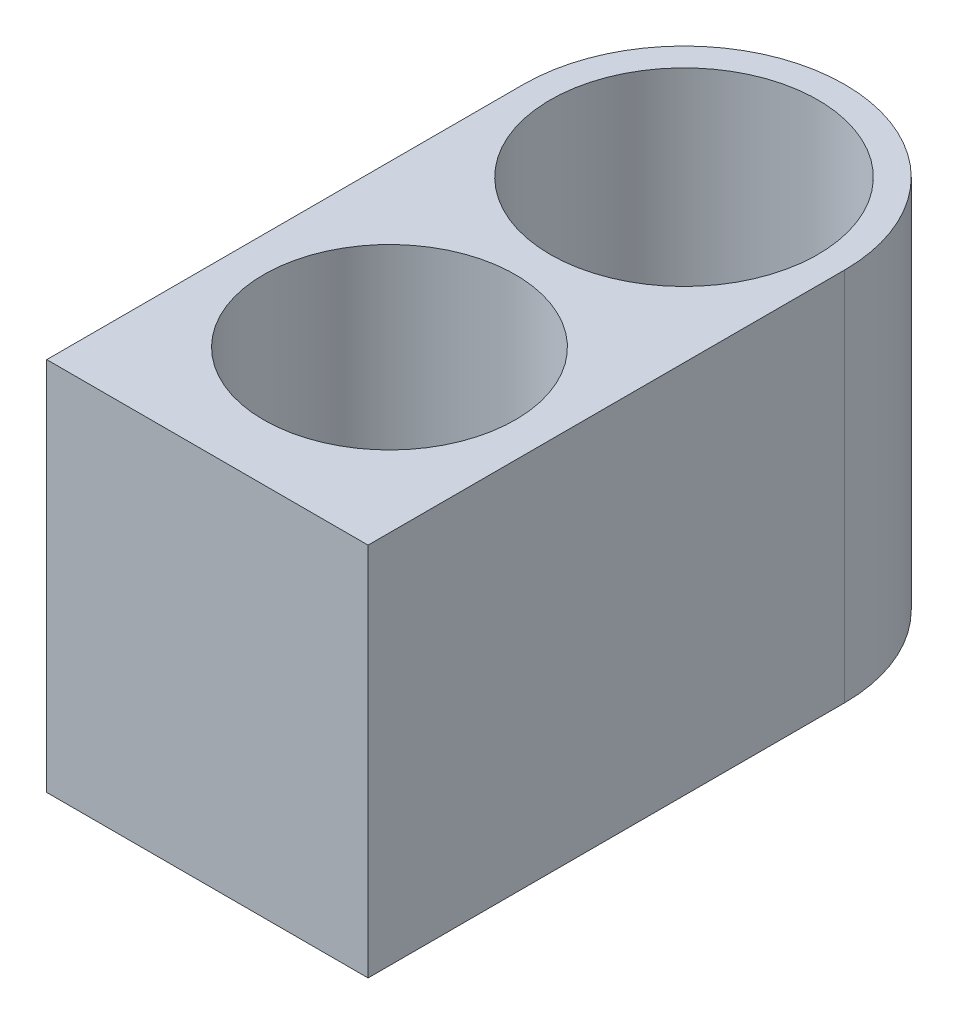
ISO-10303-21;
HEADER;
FILE_DESCRIPTION(('STEP AP214'),'2;1');
FILE_NAME('part.step','',(''),(''),'','','');
FILE_SCHEMA(('AUTOMOTIVE_DESIGN { 1 0 10303 214 1 1 1 1 }'));
ENDSEC;
DATA;
#1=APPLICATION_CONTEXT('core data for automotive mechanical design processes');
#2=APPLICATION_PROTOCOL_DEFINITION('international standard','automotive_design',2000,#1);
#3=PRODUCT_CONTEXT('',#1,'mechanical');
#4=PRODUCT('Part','Part','',(#3));
#5=PRODUCT_RELATED_PRODUCT_CATEGORY('part','',(#4));
#6=PRODUCT_DEFINITION_FORMATION('','',#4);
#7=PRODUCT_DEFINITION_CONTEXT('part definition',#1,'design');
#8=PRODUCT_DEFINITION('design','',#6,#7);
#9=PRODUCT_DEFINITION_SHAPE('','',#8);
#10=(LENGTH_UNIT() NAMED_UNIT(*) SI_UNIT(.MILLI.,.METRE.));
#11=(NAMED_UNIT(*) PLANE_ANGLE_UNIT() SI_UNIT($,.RADIAN.));
#12=(NAMED_UNIT(*) SI_UNIT($,.STERADIAN.) SOLID_ANGLE_UNIT());
#13=UNCERTAINTY_MEASURE_WITH_UNIT(LENGTH_MEASURE(1.E-05),#10,'distance_accuracy_value','');
#14=(GEOMETRIC_REPRESENTATION_CONTEXT(3) GLOBAL_UNCERTAINTY_ASSIGNED_CONTEXT((#13)) GLOBAL_UNIT_ASSIGNED_CONTEXT((#10,
#11,#12)) REPRESENTATION_CONTEXT('',''));
#15=CARTESIAN_POINT('',(0.,0.,0.));
#16=DIRECTION('',(0.,0.,1.));
#17=DIRECTION('',(1.,0.,0.));
#18=AXIS2_PLACEMENT_3D('',#15,#16,#17);
#19=CARTESIAN_POINT('',(3.,7.,6.));
#20=DIRECTION('',(-1.,0.,0.));
#21=DIRECTION('',(0.,0.,1.));
#22=AXIS2_PLACEMENT_3D('',#19,#20,#21);
#23=PLANE('',#22);
#24=DIRECTION('',(0.,1.,0.));
#25=VECTOR('',#24,1.);
#26=CARTESIAN_POINT('',(3.,0.,-2.9));
#27=LINE('',#26,#25);
#28=CARTESIAN_POINT('',(3.,0.,-2.9));
#29=VERTEX_POINT('',#28);
#30=CARTESIAN_POINT('',(3.,7.,-2.9));
#31=VERTEX_POINT('',#30);
#32=EDGE_CURVE('E53',#29,#31,#27,.T.);
#33=ORIENTED_EDGE('',*,*,#32,.T.);
#34=DIRECTION('',(0.,0.,-1.));
#35=VECTOR('',#34,1.);
#36=CARTESIAN_POINT('',(3.,7.,6.));
#37=LINE('',#36,#35);
#38=CARTESIAN_POINT('',(3.,7.,6.));
#39=VERTEX_POINT('',#38);
#40=EDGE_CURVE('E82',#39,#31,#37,.T.);
#41=ORIENTED_EDGE('',*,*,#40,.F.);
#42=DIRECTION('',(0.,-1.,0.));
#43=VECTOR('',#42,1.);
#44=CARTESIAN_POINT('',(3.,7.,6.));
#45=LINE('',#44,#43);
#46=CARTESIAN_POINT('',(3.,0.,6.));
#47=VERTEX_POINT('',#46);
#48=EDGE_CURVE('E46',#39,#47,#45,.T.);
#49=ORIENTED_EDGE('',*,*,#48,.T.);
#50=DIRECTION('',(0.,0.,-1.));
#51=VECTOR('',#50,1.);
#52=CARTESIAN_POINT('',(3.,0.,6.));
#53=LINE('',#52,#51);
#54=EDGE_CURVE('E87',#47,#29,#53,.T.);
#55=ORIENTED_EDGE('',*,*,#54,.T.);
#56=EDGE_LOOP('',(#33,#41,#49,#55));
#57=FACE_BOUND('',#56,.T.);
#58=ADVANCED_FACE('F39',(#57),#23,.F.);
#59=CARTESIAN_POINT('',(-3.,7.,6.));
#60=DIRECTION('',(1.,0.,0.));
#61=DIRECTION('',(0.,0.,-1.));
#62=AXIS2_PLACEMENT_3D('',#59,#60,#61);
#63=PLANE('',#62);
#64=DIRECTION('',(0.,0.,1.));
#65=VECTOR('',#64,1.);
#66=CARTESIAN_POINT('',(-3.,7.,6.));
#67=LINE('',#66,#65);
#68=CARTESIAN_POINT('',(-3.,7.,-2.9));
#69=VERTEX_POINT('',#68);
#70=CARTESIAN_POINT('',(-3.,7.,6.));
#71=VERTEX_POINT('',#70);
#72=EDGE_CURVE('E99',#69,#71,#67,.T.);
#73=ORIENTED_EDGE('',*,*,#72,.F.);
#74=DIRECTION('',(0.,1.,0.));
#75=VECTOR('',#74,1.);
#76=CARTESIAN_POINT('',(-3.,0.,-2.9));
#77=LINE('',#76,#75);
#78=CARTESIAN_POINT('',(-3.,0.,-2.9));
#79=VERTEX_POINT('',#78);
#80=EDGE_CURVE('E106',#79,#69,#77,.T.);
#81=ORIENTED_EDGE('',*,*,#80,.F.);
#82=DIRECTION('',(0.,0.,1.));
#83=VECTOR('',#82,1.);
#84=CARTESIAN_POINT('',(-3.,0.,6.));
#85=LINE('',#84,#83);
#86=CARTESIAN_POINT('',(-3.,0.,6.));
#87=VERTEX_POINT('',#86);
#88=EDGE_CURVE('E83',#79,#87,#85,.T.);
#89=ORIENTED_EDGE('',*,*,#88,.T.);
#90=DIRECTION('',(0.,-1.,0.));
#91=VECTOR('',#90,1.);
#92=CARTESIAN_POINT('',(-3.,7.,6.));
#93=LINE('',#92,#91);
#94=EDGE_CURVE('E11',#71,#87,#93,.T.);
#95=ORIENTED_EDGE('',*,*,#94,.F.);
#96=EDGE_LOOP('',(#73,#81,#89,#95));
#97=FACE_BOUND('',#96,.T.);
#98=ADVANCED_FACE('F134',(#97),#63,.F.);
#99=CARTESIAN_POINT('',(-3.,7.,6.));
#100=DIRECTION('',(0.,0.,-1.));
#101=DIRECTION('',(-1.,0.,0.));
#102=AXIS2_PLACEMENT_3D('',#99,#100,#101);
#103=PLANE('',#102);
#104=DIRECTION('',(1.,0.,0.));
#105=VECTOR('',#104,1.);
#106=CARTESIAN_POINT('',(-3.,0.,6.));
#107=LINE('',#106,#105);
#108=EDGE_CURVE('E74',#87,#47,#107,.T.);
#109=ORIENTED_EDGE('',*,*,#108,.T.);
#110=ORIENTED_EDGE('',*,*,#48,.F.);
#111=DIRECTION('',(1.,0.,0.));
#112=VECTOR('',#111,1.);
#113=CARTESIAN_POINT('',(-3.,7.,6.));
#114=LINE('',#113,#112);
#115=EDGE_CURVE('E62',#71,#39,#114,.T.);
#116=ORIENTED_EDGE('',*,*,#115,.F.);
#117=ORIENTED_EDGE('',*,*,#94,.T.);
#118=EDGE_LOOP('',(#109,#110,#116,#117));
#119=FACE_BOUND('',#118,.T.);
#120=ADVANCED_FACE('F76',(#119),#103,.F.);
#121=CARTESIAN_POINT('',(0.,7.,0.));
#122=DIRECTION('',(0.,-1.,0.));
#123=DIRECTION('',(0.,0.,-1.));
#124=AXIS2_PLACEMENT_3D('',#121,#122,#123);
#125=PLANE('',#124);
#126=CARTESIAN_POINT('',(0.,7.,2.6));
#127=DIRECTION('',(0.,1.,0.));
#128=DIRECTION('',(0.,0.,1.));
#129=AXIS2_PLACEMENT_3D('',#126,#127,#128);
#130=CIRCLE('',#129,2.35);
#131=CARTESIAN_POINT('',(0.,7.,4.95));
#132=VERTEX_POINT('',#131);
#133=EDGE_CURVE('E95',#132,#132,#130,.T.);
#134=ORIENTED_EDGE('',*,*,#133,.F.);
#135=EDGE_LOOP('',(#134));
#136=FACE_BOUND('',#135,.T.);
#137=CARTESIAN_POINT('',(0.,7.,-2.9));
#138=DIRECTION('',(0.,1.,0.));
#139=DIRECTION('',(0.,0.,1.));
#140=AXIS2_PLACEMENT_3D('',#137,#138,#139);
#141=CIRCLE('',#140,2.5);
#142=CARTESIAN_POINT('',(0.,7.,-0.399999999999998));
#143=VERTEX_POINT('',#142);
#144=EDGE_CURVE('E105',#143,#143,#141,.T.);
#145=ORIENTED_EDGE('',*,*,#144,.F.);
#146=EDGE_LOOP('',(#145));
#147=FACE_BOUND('',#146,.T.);
#148=ORIENTED_EDGE('',*,*,#40,.T.);
#149=CARTESIAN_POINT('',(0.,7.,-2.9));
#150=DIRECTION('',(0.,-1.,0.));
#151=DIRECTION('',(0.,0.,1.));
#152=AXIS2_PLACEMENT_3D('',#149,#150,#151);
#153=CIRCLE('',#152,3.);
#154=EDGE_CURVE('E114',#69,#31,#153,.T.);
#155=ORIENTED_EDGE('',*,*,#154,.F.);
#156=ORIENTED_EDGE('',*,*,#72,.T.);
#157=ORIENTED_EDGE('',*,*,#115,.T.);
#158=EDGE_LOOP('',(#148,#155,#156,#157));
#159=FACE_BOUND('',#158,.T.);
#160=ADVANCED_FACE('F123',(#136,#147,#159),#125,.F.);
#161=CARTESIAN_POINT('',(0.,0.,0.));
#162=DIRECTION('',(0.,-1.,0.));
#163=DIRECTION('',(0.,0.,-1.));
#164=AXIS2_PLACEMENT_3D('',#161,#162,#163);
#165=PLANE('',#164);
#166=CARTESIAN_POINT('',(0.,0.,-2.9));
#167=DIRECTION('',(0.,-1.,0.));
#168=DIRECTION('',(0.,0.,1.));
#169=AXIS2_PLACEMENT_3D('',#166,#167,#168);
#170=CIRCLE('',#169,3.);
#171=EDGE_CURVE('E90',#79,#29,#170,.T.);
#172=ORIENTED_EDGE('',*,*,#171,.T.);
#173=ORIENTED_EDGE('',*,*,#54,.F.);
#174=ORIENTED_EDGE('',*,*,#108,.F.);
#175=ORIENTED_EDGE('',*,*,#88,.F.);
#176=EDGE_LOOP('',(#172,#173,#174,#175));
#177=FACE_BOUND('',#176,.T.);
#178=CARTESIAN_POINT('',(0.,0.,2.6));
#179=DIRECTION('',(0.,1.,0.));
#180=DIRECTION('',(0.,0.,1.));
#181=AXIS2_PLACEMENT_3D('',#178,#179,#180);
#182=CIRCLE('',#181,2.35);
#183=CARTESIAN_POINT('',(0.,0.,4.95));
#184=VERTEX_POINT('',#183);
#185=EDGE_CURVE('E91',#184,#184,#182,.T.);
#186=ORIENTED_EDGE('',*,*,#185,.T.);
#187=EDGE_LOOP('',(#186));
#188=FACE_BOUND('',#187,.T.);
#189=CARTESIAN_POINT('',(0.,0.,-2.9));
#190=DIRECTION('',(0.,1.,0.));
#191=DIRECTION('',(0.,0.,1.));
#192=AXIS2_PLACEMENT_3D('',#189,#190,#191);
#193=CIRCLE('',#192,2.5);
#194=CARTESIAN_POINT('',(0.,0.,-0.399999999999998));
#195=VERTEX_POINT('',#194);
#196=EDGE_CURVE('E102',#195,#195,#193,.T.);
#197=ORIENTED_EDGE('',*,*,#196,.T.);
#198=EDGE_LOOP('',(#197));
#199=FACE_BOUND('',#198,.T.);
#200=ADVANCED_FACE('F88',(#177,#188,#199),#165,.T.);
#201=CARTESIAN_POINT('',(0.,0.,-2.9));
#202=DIRECTION('',(0.,1.,0.));
#203=DIRECTION('',(0.,0.,1.));
#204=AXIS2_PLACEMENT_3D('',#201,#202,#203);
#205=CYLINDRICAL_SURFACE('',#204,2.5);
#206=ORIENTED_EDGE('',*,*,#196,.F.);
#207=EDGE_LOOP('',(#206));
#208=FACE_BOUND('',#207,.T.);
#209=ORIENTED_EDGE('',*,*,#144,.T.);
#210=EDGE_LOOP('',(#209));
#211=FACE_BOUND('',#210,.T.);
#212=ADVANCED_FACE('F131',(#208,#211),#205,.F.);
#213=CARTESIAN_POINT('',(0.,0.,2.6));
#214=DIRECTION('',(0.,1.,0.));
#215=DIRECTION('',(0.,0.,1.));
#216=AXIS2_PLACEMENT_3D('',#213,#214,#215);
#217=CYLINDRICAL_SURFACE('',#216,2.35);
#218=ORIENTED_EDGE('',*,*,#185,.F.);
#219=EDGE_LOOP('',(#218));
#220=FACE_BOUND('',#219,.T.);
#221=ORIENTED_EDGE('',*,*,#133,.T.);
#222=EDGE_LOOP('',(#221));
#223=FACE_BOUND('',#222,.T.);
#224=ADVANCED_FACE('F174',(#220,#223),#217,.F.);
#225=CARTESIAN_POINT('',(0.,0.,-2.9));
#226=DIRECTION('',(0.,1.,0.));
#227=DIRECTION('',(0.,0.,1.));
#228=AXIS2_PLACEMENT_3D('',#225,#226,#227);
#229=CYLINDRICAL_SURFACE('',#228,3.);
#230=ORIENTED_EDGE('',*,*,#154,.T.);
#231=ORIENTED_EDGE('',*,*,#32,.F.);
#232=ORIENTED_EDGE('',*,*,#171,.F.);
#233=ORIENTED_EDGE('',*,*,#80,.T.);
#234=EDGE_LOOP('',(#230,#231,#232,#233));
#235=FACE_BOUND('',#234,.T.);
#236=ADVANCED_FACE('F118',(#235),#229,.T.);
#237=CLOSED_SHELL('',(#58,#98,#120,#160,#200,#212,#224,#236));
#238=MANIFOLD_SOLID_BREP('B2',#237);
#239=ADVANCED_BREP_SHAPE_REPRESENTATION('',(#18,#238),#14);
#240=SHAPE_DEFINITION_REPRESENTATION(#9,#239);
ENDSEC;
END-ISO-10303-21;
